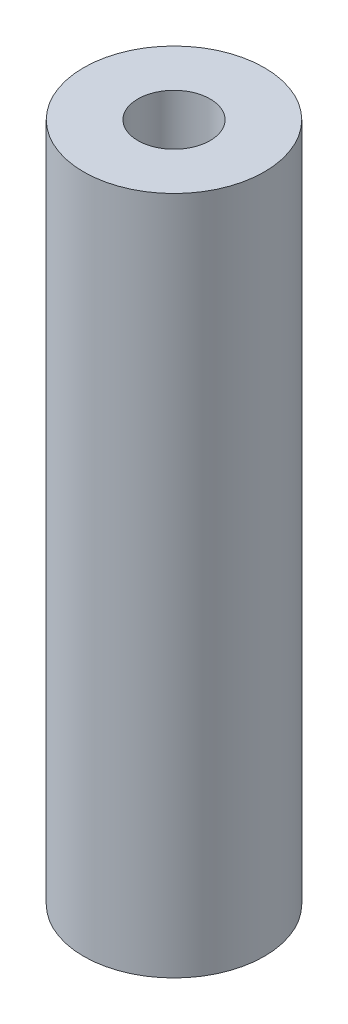
ISO-10303-21;
HEADER;
FILE_DESCRIPTION(('STEP AP214'),'2;1');
FILE_NAME('part.step','',(''),(''),'','','');
FILE_SCHEMA(('AUTOMOTIVE_DESIGN { 1 0 10303 214 1 1 1 1 }'));
ENDSEC;
DATA;
#1=APPLICATION_CONTEXT('core data for automotive mechanical design processes');
#2=APPLICATION_PROTOCOL_DEFINITION('international standard','automotive_design',2000,#1);
#3=PRODUCT_CONTEXT('',#1,'mechanical');
#4=PRODUCT('Part','Part','',(#3));
#5=PRODUCT_RELATED_PRODUCT_CATEGORY('part','',(#4));
#6=PRODUCT_DEFINITION_FORMATION('','',#4);
#7=PRODUCT_DEFINITION_CONTEXT('part definition',#1,'design');
#8=PRODUCT_DEFINITION('design','',#6,#7);
#9=PRODUCT_DEFINITION_SHAPE('','',#8);
#10=(LENGTH_UNIT() NAMED_UNIT(*) SI_UNIT(.MILLI.,.METRE.));
#11=(NAMED_UNIT(*) PLANE_ANGLE_UNIT() SI_UNIT($,.RADIAN.));
#12=(NAMED_UNIT(*) SI_UNIT($,.STERADIAN.) SOLID_ANGLE_UNIT());
#13=UNCERTAINTY_MEASURE_WITH_UNIT(LENGTH_MEASURE(1.E-05),#10,'distance_accuracy_value','');
#14=(GEOMETRIC_REPRESENTATION_CONTEXT(3) GLOBAL_UNCERTAINTY_ASSIGNED_CONTEXT((#13)) GLOBAL_UNIT_ASSIGNED_CONTEXT((#10,
#11,#12)) REPRESENTATION_CONTEXT('',''));
#15=CARTESIAN_POINT('',(0.,0.,0.));
#16=DIRECTION('',(0.,0.,1.));
#17=DIRECTION('',(1.,0.,0.));
#18=AXIS2_PLACEMENT_3D('',#15,#16,#17);
#19=CARTESIAN_POINT('',(0.,18.8,0.));
#20=DIRECTION('',(0.,1.,0.));
#21=DIRECTION('',(0.,0.,1.));
#22=AXIS2_PLACEMENT_3D('',#19,#20,#21);
#23=PLANE('',#22);
#24=CARTESIAN_POINT('',(0.,18.8,0.));
#25=DIRECTION('',(0.,1.,0.));
#26=DIRECTION('',(0.,0.,1.));
#27=AXIS2_PLACEMENT_3D('',#24,#25,#26);
#28=CIRCLE('',#27,2.5);
#29=CARTESIAN_POINT('',(0.,18.8,2.5));
#30=VERTEX_POINT('',#29);
#31=EDGE_CURVE('E10',#30,#30,#28,.T.);
#32=ORIENTED_EDGE('',*,*,#31,.T.);
#33=EDGE_LOOP('',(#32));
#34=FACE_BOUND('',#33,.T.);
#35=CARTESIAN_POINT('',(0.,18.8,0.));
#36=DIRECTION('',(0.,1.,0.));
#37=DIRECTION('',(0.,0.,1.));
#38=AXIS2_PLACEMENT_3D('',#35,#36,#37);
#39=CIRCLE('',#38,1.);
#40=CARTESIAN_POINT('',(0.,18.8,1.));
#41=VERTEX_POINT('',#40);
#42=EDGE_CURVE('E43',#41,#41,#39,.T.);
#43=ORIENTED_EDGE('',*,*,#42,.F.);
#44=EDGE_LOOP('',(#43));
#45=FACE_BOUND('',#44,.T.);
#46=ADVANCED_FACE('F32',(#34,#45),#23,.T.);
#47=CARTESIAN_POINT('',(0.,0.,0.));
#48=DIRECTION('',(0.,1.,0.));
#49=DIRECTION('',(0.,0.,1.));
#50=AXIS2_PLACEMENT_3D('',#47,#48,#49);
#51=PLANE('',#50);
#52=CARTESIAN_POINT('',(0.,0.,0.));
#53=DIRECTION('',(0.,1.,0.));
#54=DIRECTION('',(0.,0.,1.));
#55=AXIS2_PLACEMENT_3D('',#52,#53,#54);
#56=CIRCLE('',#55,2.5);
#57=CARTESIAN_POINT('',(0.,0.,2.5));
#58=VERTEX_POINT('',#57);
#59=EDGE_CURVE('E36',#58,#58,#56,.T.);
#60=ORIENTED_EDGE('',*,*,#59,.F.);
#61=EDGE_LOOP('',(#60));
#62=FACE_BOUND('',#61,.T.);
#63=CARTESIAN_POINT('',(0.,0.,0.));
#64=DIRECTION('',(0.,1.,0.));
#65=DIRECTION('',(0.,0.,1.));
#66=AXIS2_PLACEMENT_3D('',#63,#64,#65);
#67=CIRCLE('',#66,1.);
#68=CARTESIAN_POINT('',(0.,0.,1.));
#69=VERTEX_POINT('',#68);
#70=EDGE_CURVE('E45',#69,#69,#67,.T.);
#71=ORIENTED_EDGE('',*,*,#70,.T.);
#72=EDGE_LOOP('',(#71));
#73=FACE_BOUND('',#72,.T.);
#74=ADVANCED_FACE('F55',(#62,#73),#51,.F.);
#75=CARTESIAN_POINT('',(0.,18.8,0.));
#76=DIRECTION('',(0.,-1.,0.));
#77=DIRECTION('',(0.,0.,-1.));
#78=AXIS2_PLACEMENT_3D('',#75,#76,#77);
#79=CYLINDRICAL_SURFACE('',#78,2.5);
#80=ORIENTED_EDGE('',*,*,#31,.F.);
#81=EDGE_LOOP('',(#80));
#82=FACE_BOUND('',#81,.T.);
#83=ORIENTED_EDGE('',*,*,#59,.T.);
#84=EDGE_LOOP('',(#83));
#85=FACE_BOUND('',#84,.T.);
#86=ADVANCED_FACE('F34',(#82,#85),#79,.T.);
#87=CARTESIAN_POINT('',(0.,18.8,0.));
#88=DIRECTION('',(0.,-1.,0.));
#89=DIRECTION('',(0.,0.,-1.));
#90=AXIS2_PLACEMENT_3D('',#87,#88,#89);
#91=CYLINDRICAL_SURFACE('',#90,1.);
#92=ORIENTED_EDGE('',*,*,#42,.T.);
#93=EDGE_LOOP('',(#92));
#94=FACE_BOUND('',#93,.T.);
#95=ORIENTED_EDGE('',*,*,#70,.F.);
#96=EDGE_LOOP('',(#95));
#97=FACE_BOUND('',#96,.T.);
#98=ADVANCED_FACE('F51',(#94,#97),#91,.F.);
#99=CLOSED_SHELL('',(#46,#74,#86,#98));
#100=MANIFOLD_SOLID_BREP('B2',#99);
#101=ADVANCED_BREP_SHAPE_REPRESENTATION('',(#18,#100),#14);
#102=SHAPE_DEFINITION_REPRESENTATION(#9,#101);
ENDSEC;
END-ISO-10303-21;
